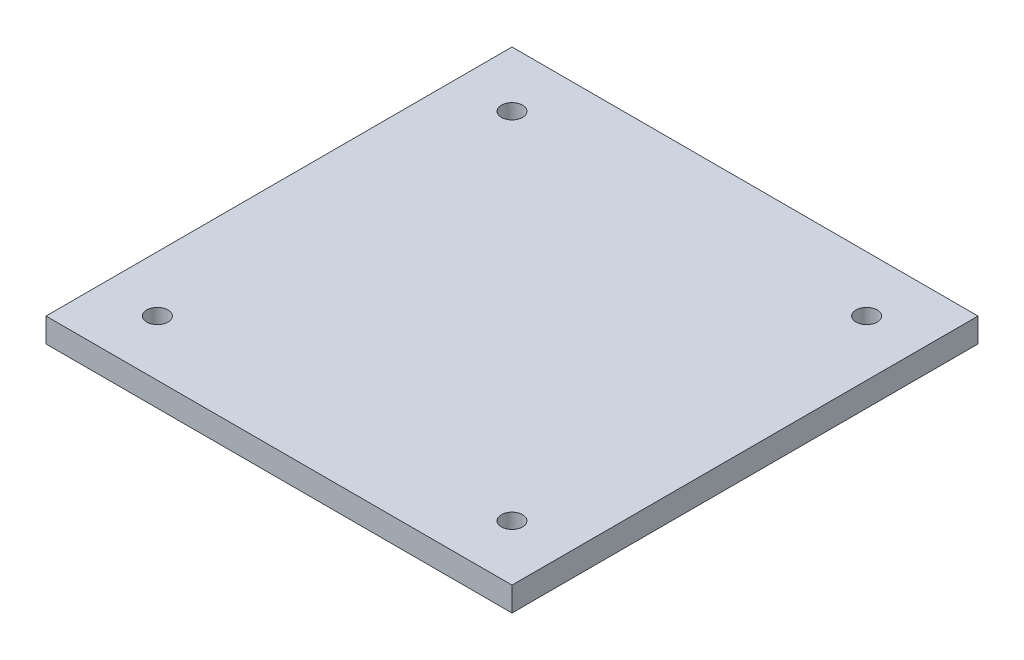
ISO-10303-21;
HEADER;
FILE_DESCRIPTION(('STEP AP214'),'2;1');
FILE_NAME('part.step','',(''),(''),'','','');
FILE_SCHEMA(('AUTOMOTIVE_DESIGN { 1 0 10303 214 1 1 1 1 }'));
ENDSEC;
DATA;
#1=APPLICATION_CONTEXT('core data for automotive mechanical design processes');
#2=APPLICATION_PROTOCOL_DEFINITION('international standard','automotive_design',2000,#1);
#3=PRODUCT_CONTEXT('',#1,'mechanical');
#4=PRODUCT('Part','Part','',(#3));
#5=PRODUCT_RELATED_PRODUCT_CATEGORY('part','',(#4));
#6=PRODUCT_DEFINITION_FORMATION('','',#4);
#7=PRODUCT_DEFINITION_CONTEXT('part definition',#1,'design');
#8=PRODUCT_DEFINITION('design','',#6,#7);
#9=PRODUCT_DEFINITION_SHAPE('','',#8);
#10=(LENGTH_UNIT() NAMED_UNIT(*) SI_UNIT(.MILLI.,.METRE.));
#11=(NAMED_UNIT(*) PLANE_ANGLE_UNIT() SI_UNIT($,.RADIAN.));
#12=(NAMED_UNIT(*) SI_UNIT($,.STERADIAN.) SOLID_ANGLE_UNIT());
#13=UNCERTAINTY_MEASURE_WITH_UNIT(LENGTH_MEASURE(1.E-05),#10,'distance_accuracy_value','');
#14=(GEOMETRIC_REPRESENTATION_CONTEXT(3) GLOBAL_UNCERTAINTY_ASSIGNED_CONTEXT((#13)) GLOBAL_UNIT_ASSIGNED_CONTEXT((#10,
#11,#12)) REPRESENTATION_CONTEXT('',''));
#15=CARTESIAN_POINT('',(0.,0.,0.));
#16=DIRECTION('',(0.,0.,1.));
#17=DIRECTION('',(1.,0.,0.));
#18=AXIS2_PLACEMENT_3D('',#15,#16,#17);
#19=CARTESIAN_POINT('',(-19.5844754492533,2.,-13.0472222222222));
#20=DIRECTION('',(1.,0.,0.));
#21=DIRECTION('',(0.,0.,-1.));
#22=AXIS2_PLACEMENT_3D('',#19,#20,#21);
#23=PLANE('',#22);
#24=DIRECTION('',(0.,0.,1.));
#25=VECTOR('',#24,1.);
#26=CARTESIAN_POINT('',(-19.5844754492533,0.,-13.0472222222222));
#27=LINE('',#26,#25);
#28=CARTESIAN_POINT('',(-19.5844754492533,0.,-13.0472222222222));
#29=VERTEX_POINT('',#28);
#30=CARTESIAN_POINT('',(-19.5844754492533,0.,25.4527777777778));
#31=VERTEX_POINT('',#30);
#32=EDGE_CURVE('E98',#29,#31,#27,.T.);
#33=ORIENTED_EDGE('',*,*,#32,.T.);
#34=DIRECTION('',(0.,-1.,0.));
#35=VECTOR('',#34,1.);
#36=CARTESIAN_POINT('',(-19.5844754492533,2.,25.4527777777778));
#37=LINE('',#36,#35);
#38=CARTESIAN_POINT('',(-19.5844754492533,2.,25.4527777777778));
#39=VERTEX_POINT('',#38);
#40=EDGE_CURVE('E11',#39,#31,#37,.T.);
#41=ORIENTED_EDGE('',*,*,#40,.F.);
#42=DIRECTION('',(0.,0.,1.));
#43=VECTOR('',#42,1.);
#44=CARTESIAN_POINT('',(-19.5844754492533,2.,-13.0472222222222));
#45=LINE('',#44,#43);
#46=CARTESIAN_POINT('',(-19.5844754492533,2.,-13.0472222222222));
#47=VERTEX_POINT('',#46);
#48=EDGE_CURVE('E86',#47,#39,#45,.T.);
#49=ORIENTED_EDGE('',*,*,#48,.F.);
#50=DIRECTION('',(0.,-1.,0.));
#51=VECTOR('',#50,1.);
#52=CARTESIAN_POINT('',(-19.5844754492533,2.,-13.0472222222222));
#53=LINE('',#52,#51);
#54=EDGE_CURVE('E94',#47,#29,#53,.T.);
#55=ORIENTED_EDGE('',*,*,#54,.T.);
#56=EDGE_LOOP('',(#33,#41,#49,#55));
#57=FACE_BOUND('',#56,.T.);
#58=ADVANCED_FACE('F35',(#57),#23,.F.);
#59=CARTESIAN_POINT('',(-19.5844754492533,2.,25.4527777777778));
#60=DIRECTION('',(0.,0.,-1.));
#61=DIRECTION('',(-1.,0.,0.));
#62=AXIS2_PLACEMENT_3D('',#59,#60,#61);
#63=PLANE('',#62);
#64=DIRECTION('',(1.,0.,0.));
#65=VECTOR('',#64,1.);
#66=CARTESIAN_POINT('',(-19.5844754492533,0.,25.4527777777778));
#67=LINE('',#66,#65);
#68=CARTESIAN_POINT('',(18.9155245507467,0.,25.4527777777778));
#69=VERTEX_POINT('',#68);
#70=EDGE_CURVE('E90',#31,#69,#67,.T.);
#71=ORIENTED_EDGE('',*,*,#70,.T.);
#72=DIRECTION('',(0.,-1.,0.));
#73=VECTOR('',#72,1.);
#74=CARTESIAN_POINT('',(18.9155245507467,2.,25.4527777777778));
#75=LINE('',#74,#73);
#76=CARTESIAN_POINT('',(18.9155245507467,2.,25.4527777777778));
#77=VERTEX_POINT('',#76);
#78=EDGE_CURVE('E43',#77,#69,#75,.T.);
#79=ORIENTED_EDGE('',*,*,#78,.F.);
#80=DIRECTION('',(1.,0.,0.));
#81=VECTOR('',#80,1.);
#82=CARTESIAN_POINT('',(-19.5844754492533,2.,25.4527777777778));
#83=LINE('',#82,#81);
#84=EDGE_CURVE('E81',#39,#77,#83,.T.);
#85=ORIENTED_EDGE('',*,*,#84,.F.);
#86=ORIENTED_EDGE('',*,*,#40,.T.);
#87=EDGE_LOOP('',(#71,#79,#85,#86));
#88=FACE_BOUND('',#87,.T.);
#89=ADVANCED_FACE('F89',(#88),#63,.F.);
#90=CARTESIAN_POINT('',(18.9155245507467,2.,-13.0472222222222));
#91=DIRECTION('',(-1.,0.,0.));
#92=DIRECTION('',(0.,0.,1.));
#93=AXIS2_PLACEMENT_3D('',#90,#91,#92);
#94=PLANE('',#93);
#95=DIRECTION('',(0.,0.,-1.));
#96=VECTOR('',#95,1.);
#97=CARTESIAN_POINT('',(18.9155245507467,0.,-13.0472222222222));
#98=LINE('',#97,#96);
#99=CARTESIAN_POINT('',(18.9155245507467,0.,-13.0472222222222));
#100=VERTEX_POINT('',#99);
#101=EDGE_CURVE('E68',#69,#100,#98,.T.);
#102=ORIENTED_EDGE('',*,*,#101,.T.);
#103=DIRECTION('',(0.,-1.,0.));
#104=VECTOR('',#103,1.);
#105=CARTESIAN_POINT('',(18.9155245507467,2.,-13.0472222222222));
#106=LINE('',#105,#104);
#107=CARTESIAN_POINT('',(18.9155245507467,2.,-13.0472222222222));
#108=VERTEX_POINT('',#107);
#109=EDGE_CURVE('E91',#108,#100,#106,.T.);
#110=ORIENTED_EDGE('',*,*,#109,.F.);
#111=DIRECTION('',(0.,0.,-1.));
#112=VECTOR('',#111,1.);
#113=CARTESIAN_POINT('',(18.9155245507467,2.,-13.0472222222222));
#114=LINE('',#113,#112);
#115=EDGE_CURVE('E84',#77,#108,#114,.T.);
#116=ORIENTED_EDGE('',*,*,#115,.F.);
#117=ORIENTED_EDGE('',*,*,#78,.T.);
#118=EDGE_LOOP('',(#102,#110,#116,#117));
#119=FACE_BOUND('',#118,.T.);
#120=ADVANCED_FACE('F92',(#119),#94,.F.);
#121=CARTESIAN_POINT('',(-19.5844754492533,2.,-13.0472222222222));
#122=DIRECTION('',(0.,0.,1.));
#123=DIRECTION('',(1.,0.,0.));
#124=AXIS2_PLACEMENT_3D('',#121,#122,#123);
#125=PLANE('',#124);
#126=DIRECTION('',(-1.,0.,0.));
#127=VECTOR('',#126,1.);
#128=CARTESIAN_POINT('',(-19.5844754492533,0.,-13.0472222222222));
#129=LINE('',#128,#127);
#130=EDGE_CURVE('E74',#100,#29,#129,.T.);
#131=ORIENTED_EDGE('',*,*,#130,.T.);
#132=ORIENTED_EDGE('',*,*,#54,.F.);
#133=DIRECTION('',(-1.,0.,0.));
#134=VECTOR('',#133,1.);
#135=CARTESIAN_POINT('',(-19.5844754492533,2.,-13.0472222222222));
#136=LINE('',#135,#134);
#137=EDGE_CURVE('E51',#108,#47,#136,.T.);
#138=ORIENTED_EDGE('',*,*,#137,.F.);
#139=ORIENTED_EDGE('',*,*,#109,.T.);
#140=EDGE_LOOP('',(#131,#132,#138,#139));
#141=FACE_BOUND('',#140,.T.);
#142=ADVANCED_FACE('F106',(#141),#125,.F.);
#143=CARTESIAN_POINT('',(0.,2.,0.));
#144=DIRECTION('',(0.,1.,0.));
#145=DIRECTION('',(0.,0.,1.));
#146=AXIS2_PLACEMENT_3D('',#143,#144,#145);
#147=PLANE('',#146);
#148=CARTESIAN_POINT('',(-14.9844754492533,2.,-8.44722222222222));
#149=DIRECTION('',(0.,1.,0.));
#150=DIRECTION('',(0.,0.,1.));
#151=AXIS2_PLACEMENT_3D('',#148,#149,#150);
#152=CIRCLE('',#151,0.874999999999999);
#153=CARTESIAN_POINT('',(-14.9844754492533,2.,-7.57222222222222));
#154=VERTEX_POINT('',#153);
#155=EDGE_CURVE('E132',#154,#154,#152,.T.);
#156=ORIENTED_EDGE('',*,*,#155,.F.);
#157=EDGE_LOOP('',(#156));
#158=FACE_BOUND('',#157,.T.);
#159=CARTESIAN_POINT('',(14.3155245507467,2.,20.8527777777778));
#160=DIRECTION('',(0.,1.,0.));
#161=DIRECTION('',(0.,0.,1.));
#162=AXIS2_PLACEMENT_3D('',#159,#160,#161);
#163=CIRCLE('',#162,0.874999999999999);
#164=CARTESIAN_POINT('',(14.3155245507467,2.,21.7277777777778));
#165=VERTEX_POINT('',#164);
#166=EDGE_CURVE('E126',#165,#165,#163,.T.);
#167=ORIENTED_EDGE('',*,*,#166,.F.);
#168=EDGE_LOOP('',(#167));
#169=FACE_BOUND('',#168,.T.);
#170=CARTESIAN_POINT('',(14.3155245507467,2.,-8.44722222222222));
#171=DIRECTION('',(0.,1.,0.));
#172=DIRECTION('',(0.,0.,1.));
#173=AXIS2_PLACEMENT_3D('',#170,#171,#172);
#174=CIRCLE('',#173,0.874999999999999);
#175=CARTESIAN_POINT('',(14.3155245507467,2.,-7.57222222222222));
#176=VERTEX_POINT('',#175);
#177=EDGE_CURVE('E120',#176,#176,#174,.T.);
#178=ORIENTED_EDGE('',*,*,#177,.F.);
#179=EDGE_LOOP('',(#178));
#180=FACE_BOUND('',#179,.T.);
#181=CARTESIAN_POINT('',(-14.9844754492533,2.,20.8527777777778));
#182=DIRECTION('',(0.,1.,0.));
#183=DIRECTION('',(0.,0.,1.));
#184=AXIS2_PLACEMENT_3D('',#181,#182,#183);
#185=CIRCLE('',#184,0.874999999999999);
#186=CARTESIAN_POINT('',(-14.9844754492533,2.,21.7277777777778));
#187=VERTEX_POINT('',#186);
#188=EDGE_CURVE('E114',#187,#187,#185,.T.);
#189=ORIENTED_EDGE('',*,*,#188,.F.);
#190=EDGE_LOOP('',(#189));
#191=FACE_BOUND('',#190,.T.);
#192=ORIENTED_EDGE('',*,*,#48,.T.);
#193=ORIENTED_EDGE('',*,*,#84,.T.);
#194=ORIENTED_EDGE('',*,*,#115,.T.);
#195=ORIENTED_EDGE('',*,*,#137,.T.);
#196=EDGE_LOOP('',(#192,#193,#194,#195));
#197=FACE_BOUND('',#196,.T.);
#198=ADVANCED_FACE('F82',(#158,#169,#180,#191,#197),#147,.T.);
#199=CARTESIAN_POINT('',(0.,0.,0.));
#200=DIRECTION('',(0.,1.,0.));
#201=DIRECTION('',(0.,0.,1.));
#202=AXIS2_PLACEMENT_3D('',#199,#200,#201);
#203=PLANE('',#202);
#204=CARTESIAN_POINT('',(-14.9844754492533,0.,-8.44722222222222));
#205=DIRECTION('',(0.,1.,0.));
#206=DIRECTION('',(0.,0.,1.));
#207=AXIS2_PLACEMENT_3D('',#204,#205,#206);
#208=CIRCLE('',#207,0.874999999999999);
#209=CARTESIAN_POINT('',(-14.9844754492533,0.,-7.57222222222222));
#210=VERTEX_POINT('',#209);
#211=EDGE_CURVE('E129',#210,#210,#208,.T.);
#212=ORIENTED_EDGE('',*,*,#211,.T.);
#213=EDGE_LOOP('',(#212));
#214=FACE_BOUND('',#213,.T.);
#215=CARTESIAN_POINT('',(14.3155245507467,0.,20.8527777777778));
#216=DIRECTION('',(0.,1.,0.));
#217=DIRECTION('',(0.,0.,1.));
#218=AXIS2_PLACEMENT_3D('',#215,#216,#217);
#219=CIRCLE('',#218,0.874999999999999);
#220=CARTESIAN_POINT('',(14.3155245507467,0.,21.7277777777778));
#221=VERTEX_POINT('',#220);
#222=EDGE_CURVE('E123',#221,#221,#219,.T.);
#223=ORIENTED_EDGE('',*,*,#222,.T.);
#224=EDGE_LOOP('',(#223));
#225=FACE_BOUND('',#224,.T.);
#226=CARTESIAN_POINT('',(14.3155245507467,0.,-8.44722222222222));
#227=DIRECTION('',(0.,1.,0.));
#228=DIRECTION('',(0.,0.,1.));
#229=AXIS2_PLACEMENT_3D('',#226,#227,#228);
#230=CIRCLE('',#229,0.874999999999999);
#231=CARTESIAN_POINT('',(14.3155245507467,0.,-7.57222222222222));
#232=VERTEX_POINT('',#231);
#233=EDGE_CURVE('E117',#232,#232,#230,.T.);
#234=ORIENTED_EDGE('',*,*,#233,.T.);
#235=EDGE_LOOP('',(#234));
#236=FACE_BOUND('',#235,.T.);
#237=CARTESIAN_POINT('',(-14.9844754492533,0.,20.8527777777778));
#238=DIRECTION('',(0.,1.,0.));
#239=DIRECTION('',(0.,0.,1.));
#240=AXIS2_PLACEMENT_3D('',#237,#238,#239);
#241=CIRCLE('',#240,0.874999999999999);
#242=CARTESIAN_POINT('',(-14.9844754492533,0.,21.7277777777778));
#243=VERTEX_POINT('',#242);
#244=EDGE_CURVE('E101',#243,#243,#241,.T.);
#245=ORIENTED_EDGE('',*,*,#244,.T.);
#246=EDGE_LOOP('',(#245));
#247=FACE_BOUND('',#246,.T.);
#248=ORIENTED_EDGE('',*,*,#32,.F.);
#249=ORIENTED_EDGE('',*,*,#130,.F.);
#250=ORIENTED_EDGE('',*,*,#101,.F.);
#251=ORIENTED_EDGE('',*,*,#70,.F.);
#252=EDGE_LOOP('',(#248,#249,#250,#251));
#253=FACE_BOUND('',#252,.T.);
#254=ADVANCED_FACE('F109',(#214,#225,#236,#247,#253),#203,.F.);
#255=CARTESIAN_POINT('',(-14.9844754492533,2.,20.8527777777778));
#256=DIRECTION('',(0.,1.,0.));
#257=DIRECTION('',(0.,0.,1.));
#258=AXIS2_PLACEMENT_3D('',#255,#256,#257);
#259=CYLINDRICAL_SURFACE('',#258,0.874999999999999);
#260=ORIENTED_EDGE('',*,*,#244,.F.);
#261=EDGE_LOOP('',(#260));
#262=FACE_BOUND('',#261,.T.);
#263=ORIENTED_EDGE('',*,*,#188,.T.);
#264=EDGE_LOOP('',(#263));
#265=FACE_BOUND('',#264,.T.);
#266=ADVANCED_FACE('F147',(#262,#265),#259,.F.);
#267=CARTESIAN_POINT('',(14.3155245507467,2.,-8.44722222222222));
#268=DIRECTION('',(0.,1.,0.));
#269=DIRECTION('',(0.,0.,1.));
#270=AXIS2_PLACEMENT_3D('',#267,#268,#269);
#271=CYLINDRICAL_SURFACE('',#270,0.874999999999999);
#272=ORIENTED_EDGE('',*,*,#233,.F.);
#273=EDGE_LOOP('',(#272));
#274=FACE_BOUND('',#273,.T.);
#275=ORIENTED_EDGE('',*,*,#177,.T.);
#276=EDGE_LOOP('',(#275));
#277=FACE_BOUND('',#276,.T.);
#278=ADVANCED_FACE('F149',(#274,#277),#271,.F.);
#279=CARTESIAN_POINT('',(14.3155245507467,2.,20.8527777777778));
#280=DIRECTION('',(0.,1.,0.));
#281=DIRECTION('',(0.,0.,1.));
#282=AXIS2_PLACEMENT_3D('',#279,#280,#281);
#283=CYLINDRICAL_SURFACE('',#282,0.874999999999999);
#284=ORIENTED_EDGE('',*,*,#222,.F.);
#285=EDGE_LOOP('',(#284));
#286=FACE_BOUND('',#285,.T.);
#287=ORIENTED_EDGE('',*,*,#166,.T.);
#288=EDGE_LOOP('',(#287));
#289=FACE_BOUND('',#288,.T.);
#290=ADVANCED_FACE('F156',(#286,#289),#283,.F.);
#291=CARTESIAN_POINT('',(-14.9844754492533,2.,-8.44722222222222));
#292=DIRECTION('',(0.,1.,0.));
#293=DIRECTION('',(0.,0.,1.));
#294=AXIS2_PLACEMENT_3D('',#291,#292,#293);
#295=CYLINDRICAL_SURFACE('',#294,0.874999999999999);
#296=ORIENTED_EDGE('',*,*,#211,.F.);
#297=EDGE_LOOP('',(#296));
#298=FACE_BOUND('',#297,.T.);
#299=ORIENTED_EDGE('',*,*,#155,.T.);
#300=EDGE_LOOP('',(#299));
#301=FACE_BOUND('',#300,.T.);
#302=ADVANCED_FACE('F136',(#298,#301),#295,.F.);
#303=CLOSED_SHELL('',(#58,#89,#120,#142,#198,#254,#266,#278,#290,#302));
#304=MANIFOLD_SOLID_BREP('B2',#303);
#305=ADVANCED_BREP_SHAPE_REPRESENTATION('',(#18,#304),#14);
#306=SHAPE_DEFINITION_REPRESENTATION(#9,#305);
ENDSEC;
END-ISO-10303-21;
